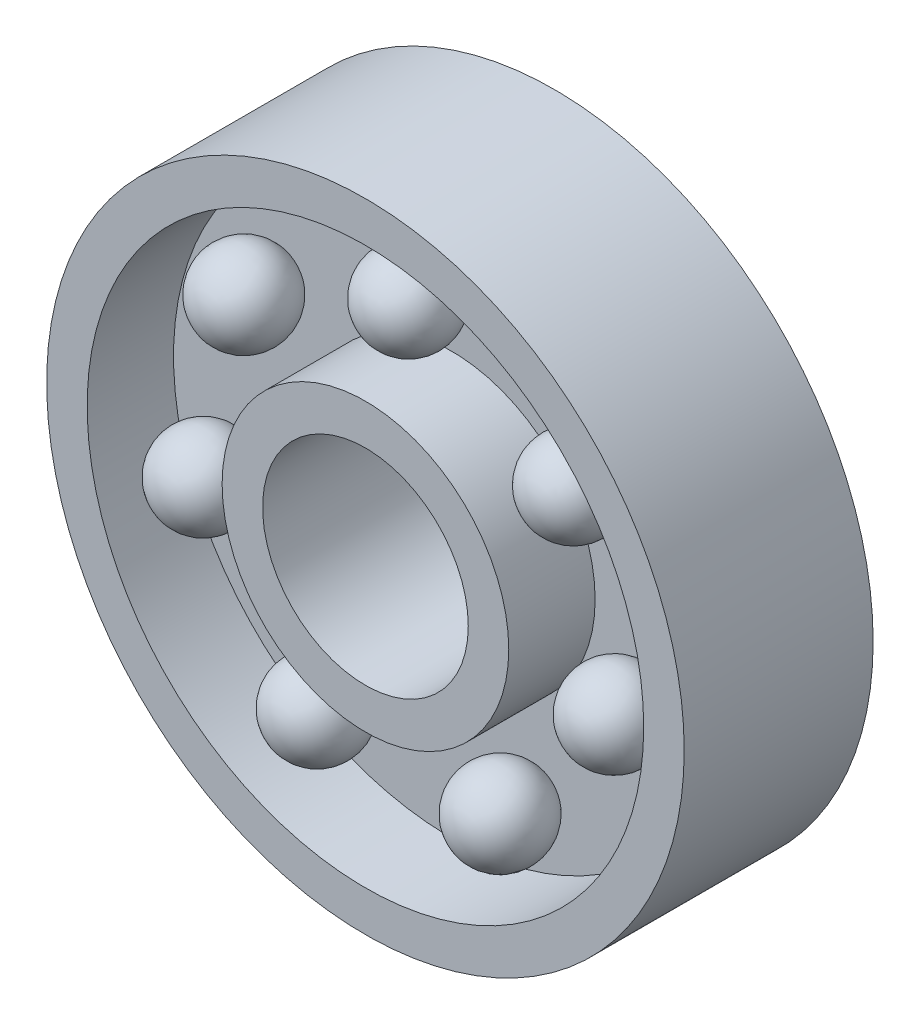
ISO-10303-21;
HEADER;
FILE_DESCRIPTION(('STEP AP214'),'2;1');
FILE_NAME('part.step','',(''),(''),'','','');
FILE_SCHEMA(('AUTOMOTIVE_DESIGN { 1 0 10303 214 1 1 1 1 }'));
ENDSEC;
DATA;
#1=APPLICATION_CONTEXT('core data for automotive mechanical design processes');
#2=APPLICATION_PROTOCOL_DEFINITION('international standard','automotive_design',2000,#1);
#3=PRODUCT_CONTEXT('',#1,'mechanical');
#4=PRODUCT('Part','Part','',(#3));
#5=PRODUCT_RELATED_PRODUCT_CATEGORY('part','',(#4));
#6=PRODUCT_DEFINITION_FORMATION('','',#4);
#7=PRODUCT_DEFINITION_CONTEXT('part definition',#1,'design');
#8=PRODUCT_DEFINITION('design','',#6,#7);
#9=PRODUCT_DEFINITION_SHAPE('','',#8);
#10=(LENGTH_UNIT() NAMED_UNIT(*) SI_UNIT(.MILLI.,.METRE.));
#11=(NAMED_UNIT(*) PLANE_ANGLE_UNIT() SI_UNIT($,.RADIAN.));
#12=(NAMED_UNIT(*) SI_UNIT($,.STERADIAN.) SOLID_ANGLE_UNIT());
#13=UNCERTAINTY_MEASURE_WITH_UNIT(LENGTH_MEASURE(1.E-05),#10,'distance_accuracy_value','');
#14=(GEOMETRIC_REPRESENTATION_CONTEXT(3) GLOBAL_UNCERTAINTY_ASSIGNED_CONTEXT((#13)) GLOBAL_UNIT_ASSIGNED_CONTEXT((#10,
#11,#12)) REPRESENTATION_CONTEXT('',''));
#15=CARTESIAN_POINT('',(0.,0.,0.));
#16=DIRECTION('',(0.,0.,1.));
#17=DIRECTION('',(1.,0.,0.));
#18=AXIS2_PLACEMENT_3D('',#15,#16,#17);
#19=CARTESIAN_POINT('',(0.,-3.81,8.75675918886153));
#20=DIRECTION('',(0.,0.,1.));
#21=DIRECTION('',(1.,0.,0.));
#22=AXIS2_PLACEMENT_3D('',#19,#20,#21);
#23=CYLINDRICAL_SURFACE('',#22,10.31);
#24=CARTESIAN_POINT('',(0.,-3.81,0.300000000000002));
#25=DIRECTION('',(0.,0.,1.));
#26=DIRECTION('',(1.,0.,0.));
#27=AXIS2_PLACEMENT_3D('',#24,#25,#26);
#28=CIRCLE('',#27,10.31);
#29=CARTESIAN_POINT('',(10.31,-3.81,0.300000000000002));
#30=VERTEX_POINT('',#29);
#31=EDGE_CURVE('E13',#30,#30,#28,.T.);
#32=ORIENTED_EDGE('',*,*,#31,.T.);
#33=EDGE_LOOP('',(#32));
#34=FACE_BOUND('',#33,.T.);
#35=CARTESIAN_POINT('',(0.,-3.81,3.2));
#36=DIRECTION('',(0.,0.,1.));
#37=DIRECTION('',(1.,0.,0.));
#38=AXIS2_PLACEMENT_3D('',#35,#36,#37);
#39=CIRCLE('',#38,10.31);
#40=CARTESIAN_POINT('',(10.31,-3.81,3.2));
#41=VERTEX_POINT('',#40);
#42=EDGE_CURVE('E63',#41,#41,#39,.T.);
#43=ORIENTED_EDGE('',*,*,#42,.F.);
#44=EDGE_LOOP('',(#43));
#45=FACE_BOUND('',#44,.T.);
#46=ADVANCED_FACE('F55',(#34,#45),#23,.T.);
#47=CARTESIAN_POINT('',(0.,0.,3.2));
#48=DIRECTION('',(0.,0.,1.));
#49=DIRECTION('',(1.,0.,0.));
#50=AXIS2_PLACEMENT_3D('',#47,#48,#49);
#51=PLANE('',#50);
#52=ORIENTED_EDGE('',*,*,#42,.T.);
#53=EDGE_LOOP('',(#52));
#54=FACE_BOUND('',#53,.T.);
#55=CARTESIAN_POINT('',(0.,-3.81,3.2));
#56=DIRECTION('',(0.,0.,1.));
#57=DIRECTION('',(1.,0.,0.));
#58=AXIS2_PLACEMENT_3D('',#55,#56,#57);
#59=CIRCLE('',#58,5.31);
#60=CARTESIAN_POINT('',(5.31,-3.81,3.2));
#61=VERTEX_POINT('',#60);
#62=EDGE_CURVE('E59',#61,#61,#59,.T.);
#63=ORIENTED_EDGE('',*,*,#62,.F.);
#64=EDGE_LOOP('',(#63));
#65=FACE_BOUND('',#64,.T.);
#66=ADVANCED_FACE('F78',(#54,#65),#51,.T.);
#67=CARTESIAN_POINT('',(0.,0.,0.300000000000001));
#68=DIRECTION('',(0.,0.,-1.));
#69=DIRECTION('',(-1.,0.,0.));
#70=AXIS2_PLACEMENT_3D('',#67,#68,#69);
#71=PLANE('',#70);
#72=ORIENTED_EDGE('',*,*,#31,.F.);
#73=EDGE_LOOP('',(#72));
#74=FACE_BOUND('',#73,.T.);
#75=CARTESIAN_POINT('',(0.,-3.81,0.300000000000002));
#76=DIRECTION('',(0.,0.,1.));
#77=DIRECTION('',(1.,0.,0.));
#78=AXIS2_PLACEMENT_3D('',#75,#76,#77);
#79=CIRCLE('',#78,5.31);
#80=CARTESIAN_POINT('',(5.31,-3.81,0.300000000000002));
#81=VERTEX_POINT('',#80);
#82=EDGE_CURVE('E69',#81,#81,#79,.T.);
#83=ORIENTED_EDGE('',*,*,#82,.T.);
#84=EDGE_LOOP('',(#83));
#85=FACE_BOUND('',#84,.T.);
#86=ADVANCED_FACE('F80',(#74,#85),#71,.T.);
#87=CARTESIAN_POINT('',(0.,-3.81,8.75675918886153));
#88=DIRECTION('',(0.,0.,1.));
#89=DIRECTION('',(1.,0.,0.));
#90=AXIS2_PLACEMENT_3D('',#87,#88,#89);
#91=CYLINDRICAL_SURFACE('',#90,5.31);
#92=ORIENTED_EDGE('',*,*,#62,.T.);
#93=EDGE_LOOP('',(#92));
#94=FACE_BOUND('',#93,.T.);
#95=ORIENTED_EDGE('',*,*,#82,.F.);
#96=EDGE_LOOP('',(#95));
#97=FACE_BOUND('',#96,.T.);
#98=ADVANCED_FACE('F57',(#94,#97),#91,.F.);
#99=CLOSED_SHELL('',(#46,#66,#86,#98));
#100=MANIFOLD_SOLID_BREP('B2',#99);
#101=CARTESIAN_POINT('',(-6.10610387807525,1.05945535251678,5.4));
#102=DIRECTION('',(0.,0.,1.));
#103=DIRECTION('',(-0.781831482468022,0.623489801858743,0.));
#104=AXIS2_PLACEMENT_3D('',#101,#102,#103);
#105=SPHERICAL_SURFACE('',#104,1.6);
#106=CARTESIAN_POINT('',(-6.10610387807525,1.05945535251678,7.));
#107=VERTEX_POINT('',#106);
#108=VERTEX_LOOP('',#107);
#109=FACE_BOUND('',#108,.T.);
#110=ADVANCED_FACE('F137',(#109),#105,.T.);
#111=CLOSED_SHELL('',(#110));
#112=MANIFOLD_SOLID_BREP('B8',#111);
#113=CARTESIAN_POINT('',(-7.61418699414006,-5.54788849419874,5.4));
#114=DIRECTION('',(0.,0.,1.));
#115=DIRECTION('',(-0.974927912181826,-0.222520933956305,0.));
#116=AXIS2_PLACEMENT_3D('',#113,#114,#115);
#117=SPHERICAL_SURFACE('',#116,1.6);
#118=CARTESIAN_POINT('',(-7.61418699414006,-5.54788849419874,7.));
#119=VERTEX_POINT('',#118);
#120=VERTEX_LOOP('',#119);
#121=FACE_BOUND('',#120,.T.);
#122=ADVANCED_FACE('F159',(#121),#117,.T.);
#123=CLOSED_SHELL('',(#122));
#124=MANIFOLD_SOLID_BREP('B51',#123);
#125=CARTESIAN_POINT('',(-3.38863200250818,-10.8465668583179,5.4));
#126=DIRECTION('',(0.,0.,1.));
#127=DIRECTION('',(-0.433883739117565,-0.900968867902416,0.));
#128=AXIS2_PLACEMENT_3D('',#125,#126,#127);
#129=SPHERICAL_SURFACE('',#128,1.6);
#130=CARTESIAN_POINT('',(-3.38863200250818,-10.8465668583179,7.));
#131=VERTEX_POINT('',#130);
#132=VERTEX_LOOP('',#131);
#133=FACE_BOUND('',#132,.T.);
#134=ADVANCED_FACE('F181',(#133),#129,.T.);
#135=CLOSED_SHELL('',(#134));
#136=MANIFOLD_SOLID_BREP('B133',#135);
#137=CARTESIAN_POINT('',(3.38863200250809,-10.8465668583179,5.4));
#138=DIRECTION('',(0.,0.,1.));
#139=DIRECTION('',(0.433883739117553,-0.900968867902422,0.));
#140=AXIS2_PLACEMENT_3D('',#137,#138,#139);
#141=SPHERICAL_SURFACE('',#140,1.6);
#142=CARTESIAN_POINT('',(3.38863200250809,-10.8465668583179,7.));
#143=VERTEX_POINT('',#142);
#144=VERTEX_LOOP('',#143);
#145=FACE_BOUND('',#144,.T.);
#146=ADVANCED_FACE('F203',(#145),#141,.T.);
#147=CLOSED_SHELL('',(#146));
#148=MANIFOLD_SOLID_BREP('B155',#147);
#149=CARTESIAN_POINT('',(7.61418699414003,-5.54788849419885,5.4));
#150=DIRECTION('',(0.,0.,1.));
#151=DIRECTION('',(0.974927912181823,-0.222520933956318,0.));
#152=AXIS2_PLACEMENT_3D('',#149,#150,#151);
#153=SPHERICAL_SURFACE('',#152,1.6);
#154=CARTESIAN_POINT('',(7.61418699414003,-5.54788849419885,7.));
#155=VERTEX_POINT('',#154);
#156=VERTEX_LOOP('',#155);
#157=FACE_BOUND('',#156,.T.);
#158=ADVANCED_FACE('F225',(#157),#153,.T.);
#159=CLOSED_SHELL('',(#158));
#160=MANIFOLD_SOLID_BREP('B177',#159);
#161=CARTESIAN_POINT('',(6.10610387807532,1.0594553525167,5.4));
#162=DIRECTION('',(0.,0.,1.));
#163=DIRECTION('',(0.781831482468031,0.623489801858732,0.));
#164=AXIS2_PLACEMENT_3D('',#161,#162,#163);
#165=SPHERICAL_SURFACE('',#164,1.6);
#166=CARTESIAN_POINT('',(6.10610387807532,1.0594553525167,7.));
#167=VERTEX_POINT('',#166);
#168=VERTEX_LOOP('',#167);
#169=FACE_BOUND('',#168,.T.);
#170=ADVANCED_FACE('F247',(#169),#165,.T.);
#171=CLOSED_SHELL('',(#170));
#172=MANIFOLD_SOLID_BREP('B199',#171);
#173=CARTESIAN_POINT('',(0.,4.,5.4));
#174=DIRECTION('',(0.,0.,1.));
#175=DIRECTION('',(0.,1.,0.));
#176=AXIS2_PLACEMENT_3D('',#173,#174,#175);
#177=SPHERICAL_SURFACE('',#176,1.6);
#178=CARTESIAN_POINT('',(0.,4.,7.));
#179=VERTEX_POINT('',#178);
#180=VERTEX_LOOP('',#179);
#181=FACE_BOUND('',#180,.T.);
#182=ADVANCED_FACE('F271',(#181),#177,.T.);
#183=CLOSED_SHELL('',(#182));
#184=MANIFOLD_SOLID_BREP('B221',#183);
#185=CARTESIAN_POINT('',(0.,1.5,0.));
#186=DIRECTION('',(0.,0.,1.));
#187=DIRECTION('',(1.,0.,0.));
#188=AXIS2_PLACEMENT_3D('',#185,#186,#187);
#189=PLANE('',#188);
#190=CARTESIAN_POINT('',(0.,-3.81,0.));
#191=DIRECTION('',(0.,0.,1.));
#192=DIRECTION('',(1.,0.,0.));
#193=AXIS2_PLACEMENT_3D('',#190,#191,#192);
#194=CIRCLE('',#193,5.31);
#195=CARTESIAN_POINT('',(5.31,-3.81,0.));
#196=VERTEX_POINT('',#195);
#197=EDGE_CURVE('E330',#196,#196,#194,.T.);
#198=ORIENTED_EDGE('',*,*,#197,.F.);
#199=EDGE_LOOP('',(#198));
#200=FACE_BOUND('',#199,.T.);
#201=CARTESIAN_POINT('',(0.,-3.81,0.));
#202=DIRECTION('',(0.,0.,1.));
#203=DIRECTION('',(1.,0.,0.));
#204=AXIS2_PLACEMENT_3D('',#201,#202,#203);
#205=CIRCLE('',#204,3.81);
#206=CARTESIAN_POINT('',(3.81,-3.81,0.));
#207=VERTEX_POINT('',#206);
#208=EDGE_CURVE('E270',#207,#207,#205,.T.);
#209=ORIENTED_EDGE('',*,*,#208,.T.);
#210=EDGE_LOOP('',(#209));
#211=FACE_BOUND('',#210,.T.);
#212=ADVANCED_FACE('F290',(#200,#211),#189,.F.);
#213=CARTESIAN_POINT('',(0.,-3.81,8.75675918886153));
#214=DIRECTION('',(0.,0.,1.));
#215=DIRECTION('',(1.,0.,0.));
#216=AXIS2_PLACEMENT_3D('',#213,#214,#215);
#217=CYLINDRICAL_SURFACE('',#216,3.81);
#218=ORIENTED_EDGE('',*,*,#208,.F.);
#219=EDGE_LOOP('',(#218));
#220=FACE_BOUND('',#219,.T.);
#221=CARTESIAN_POINT('',(0.,-3.81,7.));
#222=DIRECTION('',(0.,0.,1.));
#223=DIRECTION('',(1.,0.,0.));
#224=AXIS2_PLACEMENT_3D('',#221,#222,#223);
#225=CIRCLE('',#224,3.81);
#226=CARTESIAN_POINT('',(3.81,-3.81,7.));
#227=VERTEX_POINT('',#226);
#228=EDGE_CURVE('E296',#227,#227,#225,.T.);
#229=ORIENTED_EDGE('',*,*,#228,.T.);
#230=EDGE_LOOP('',(#229));
#231=FACE_BOUND('',#230,.T.);
#232=ADVANCED_FACE('F337',(#220,#231),#217,.F.);
#233=CARTESIAN_POINT('',(0.,0.,7.));
#234=DIRECTION('',(0.,0.,-1.));
#235=DIRECTION('',(-1.,0.,0.));
#236=AXIS2_PLACEMENT_3D('',#233,#234,#235);
#237=PLANE('',#236);
#238=ORIENTED_EDGE('',*,*,#228,.F.);
#239=EDGE_LOOP('',(#238));
#240=FACE_BOUND('',#239,.T.);
#241=CARTESIAN_POINT('',(0.,-3.81,7.));
#242=DIRECTION('',(0.,0.,1.));
#243=DIRECTION('',(1.,0.,0.));
#244=AXIS2_PLACEMENT_3D('',#241,#242,#243);
#245=CIRCLE('',#244,5.31);
#246=CARTESIAN_POINT('',(5.31,-3.81,7.));
#247=VERTEX_POINT('',#246);
#248=EDGE_CURVE('E300',#247,#247,#245,.T.);
#249=ORIENTED_EDGE('',*,*,#248,.T.);
#250=EDGE_LOOP('',(#249));
#251=FACE_BOUND('',#250,.T.);
#252=ADVANCED_FACE('F341',(#240,#251),#237,.F.);
#253=CARTESIAN_POINT('',(0.,-3.81,8.75675918886153));
#254=DIRECTION('',(0.,0.,1.));
#255=DIRECTION('',(1.,0.,0.));
#256=AXIS2_PLACEMENT_3D('',#253,#254,#255);
#257=CYLINDRICAL_SURFACE('',#256,5.31);
#258=ORIENTED_EDGE('',*,*,#248,.F.);
#259=EDGE_LOOP('',(#258));
#260=FACE_BOUND('',#259,.T.);
#261=CARTESIAN_POINT('',(0.,-3.81,3.8));
#262=DIRECTION('',(0.,0.,1.));
#263=DIRECTION('',(1.,0.,0.));
#264=AXIS2_PLACEMENT_3D('',#261,#262,#263);
#265=CIRCLE('',#264,5.31);
#266=CARTESIAN_POINT('',(5.31,-3.81,3.8));
#267=VERTEX_POINT('',#266);
#268=EDGE_CURVE('E304',#267,#267,#265,.T.);
#269=ORIENTED_EDGE('',*,*,#268,.T.);
#270=EDGE_LOOP('',(#269));
#271=FACE_BOUND('',#270,.T.);
#272=ADVANCED_FACE('F346',(#260,#271),#257,.T.);
#273=CARTESIAN_POINT('',(0.,1.5,3.8));
#274=DIRECTION('',(0.,0.,-1.));
#275=DIRECTION('',(-1.,0.,0.));
#276=AXIS2_PLACEMENT_3D('',#273,#274,#275);
#277=PLANE('',#276);
#278=ORIENTED_EDGE('',*,*,#268,.F.);
#279=EDGE_LOOP('',(#278));
#280=FACE_BOUND('',#279,.T.);
#281=CARTESIAN_POINT('',(0.,-3.81,3.8));
#282=DIRECTION('',(0.,0.,1.));
#283=DIRECTION('',(1.,0.,0.));
#284=AXIS2_PLACEMENT_3D('',#281,#282,#283);
#285=CIRCLE('',#284,10.31);
#286=CARTESIAN_POINT('',(10.31,-3.81,3.8));
#287=VERTEX_POINT('',#286);
#288=EDGE_CURVE('E309',#287,#287,#285,.T.);
#289=ORIENTED_EDGE('',*,*,#288,.T.);
#290=EDGE_LOOP('',(#289));
#291=FACE_BOUND('',#290,.T.);
#292=ADVANCED_FACE('F352',(#280,#291),#277,.F.);
#293=CARTESIAN_POINT('',(0.,-3.81,8.75675918886153));
#294=DIRECTION('',(0.,0.,1.));
#295=DIRECTION('',(1.,0.,0.));
#296=AXIS2_PLACEMENT_3D('',#293,#294,#295);
#297=CYLINDRICAL_SURFACE('',#296,10.31);
#298=ORIENTED_EDGE('',*,*,#288,.F.);
#299=EDGE_LOOP('',(#298));
#300=FACE_BOUND('',#299,.T.);
#301=CARTESIAN_POINT('',(0.,-3.81,7.));
#302=DIRECTION('',(0.,0.,1.));
#303=DIRECTION('',(1.,0.,0.));
#304=AXIS2_PLACEMENT_3D('',#301,#302,#303);
#305=CIRCLE('',#304,10.31);
#306=CARTESIAN_POINT('',(10.31,-3.81,7.));
#307=VERTEX_POINT('',#306);
#308=EDGE_CURVE('E312',#307,#307,#305,.T.);
#309=ORIENTED_EDGE('',*,*,#308,.T.);
#310=EDGE_LOOP('',(#309));
#311=FACE_BOUND('',#310,.T.);
#312=ADVANCED_FACE('F356',(#300,#311),#297,.F.);
#313=CARTESIAN_POINT('',(0.,6.5,7.));
#314=DIRECTION('',(0.,0.,-1.));
#315=DIRECTION('',(-1.,0.,0.));
#316=AXIS2_PLACEMENT_3D('',#313,#314,#315);
#317=PLANE('',#316);
#318=ORIENTED_EDGE('',*,*,#308,.F.);
#319=EDGE_LOOP('',(#318));
#320=FACE_BOUND('',#319,.T.);
#321=CARTESIAN_POINT('',(0.,-3.81,7.));
#322=DIRECTION('',(0.,0.,1.));
#323=DIRECTION('',(1.,0.,0.));
#324=AXIS2_PLACEMENT_3D('',#321,#322,#323);
#325=CIRCLE('',#324,11.81);
#326=CARTESIAN_POINT('',(11.81,-3.81,7.));
#327=VERTEX_POINT('',#326);
#328=EDGE_CURVE('E315',#327,#327,#325,.T.);
#329=ORIENTED_EDGE('',*,*,#328,.T.);
#330=EDGE_LOOP('',(#329));
#331=FACE_BOUND('',#330,.T.);
#332=ADVANCED_FACE('F360',(#320,#331),#317,.F.);
#333=CARTESIAN_POINT('',(0.,-3.81,8.75675918886153));
#334=DIRECTION('',(0.,0.,1.));
#335=DIRECTION('',(1.,0.,0.));
#336=AXIS2_PLACEMENT_3D('',#333,#334,#335);
#337=CYLINDRICAL_SURFACE('',#336,11.81);
#338=ORIENTED_EDGE('',*,*,#328,.F.);
#339=EDGE_LOOP('',(#338));
#340=FACE_BOUND('',#339,.T.);
#341=CARTESIAN_POINT('',(0.,-3.81,0.));
#342=DIRECTION('',(0.,0.,1.));
#343=DIRECTION('',(1.,0.,0.));
#344=AXIS2_PLACEMENT_3D('',#341,#342,#343);
#345=CIRCLE('',#344,11.81);
#346=CARTESIAN_POINT('',(11.81,-3.81,0.));
#347=VERTEX_POINT('',#346);
#348=EDGE_CURVE('E318',#347,#347,#345,.T.);
#349=ORIENTED_EDGE('',*,*,#348,.T.);
#350=EDGE_LOOP('',(#349));
#351=FACE_BOUND('',#350,.T.);
#352=ADVANCED_FACE('F364',(#340,#351),#337,.T.);
#353=CARTESIAN_POINT('',(0.,8.,0.));
#354=DIRECTION('',(0.,0.,1.));
#355=DIRECTION('',(1.,0.,0.));
#356=AXIS2_PLACEMENT_3D('',#353,#354,#355);
#357=PLANE('',#356);
#358=ORIENTED_EDGE('',*,*,#348,.F.);
#359=EDGE_LOOP('',(#358));
#360=FACE_BOUND('',#359,.T.);
#361=CARTESIAN_POINT('',(0.,-3.81,0.));
#362=DIRECTION('',(0.,0.,1.));
#363=DIRECTION('',(1.,0.,0.));
#364=AXIS2_PLACEMENT_3D('',#361,#362,#363);
#365=CIRCLE('',#364,10.31);
#366=CARTESIAN_POINT('',(10.31,-3.81,0.));
#367=VERTEX_POINT('',#366);
#368=EDGE_CURVE('E321',#367,#367,#365,.T.);
#369=ORIENTED_EDGE('',*,*,#368,.T.);
#370=EDGE_LOOP('',(#369));
#371=FACE_BOUND('',#370,.T.);
#372=ADVANCED_FACE('F368',(#360,#371),#357,.F.);
#373=CARTESIAN_POINT('',(0.,-3.81,8.75675918886153));
#374=DIRECTION('',(0.,0.,1.));
#375=DIRECTION('',(1.,0.,0.));
#376=AXIS2_PLACEMENT_3D('',#373,#374,#375);
#377=CYLINDRICAL_SURFACE('',#376,10.31);
#378=ORIENTED_EDGE('',*,*,#368,.F.);
#379=EDGE_LOOP('',(#378));
#380=FACE_BOUND('',#379,.T.);
#381=CARTESIAN_POINT('',(0.,-3.81,3.2));
#382=DIRECTION('',(0.,0.,1.));
#383=DIRECTION('',(1.,0.,0.));
#384=AXIS2_PLACEMENT_3D('',#381,#382,#383);
#385=CIRCLE('',#384,10.31);
#386=CARTESIAN_POINT('',(10.31,-3.81,3.2));
#387=VERTEX_POINT('',#386);
#388=EDGE_CURVE('E324',#387,#387,#385,.T.);
#389=ORIENTED_EDGE('',*,*,#388,.T.);
#390=EDGE_LOOP('',(#389));
#391=FACE_BOUND('',#390,.T.);
#392=ADVANCED_FACE('F372',(#380,#391),#377,.F.);
#393=CARTESIAN_POINT('',(0.,6.5,3.2));
#394=DIRECTION('',(0.,0.,1.));
#395=DIRECTION('',(1.,0.,0.));
#396=AXIS2_PLACEMENT_3D('',#393,#394,#395);
#397=PLANE('',#396);
#398=ORIENTED_EDGE('',*,*,#388,.F.);
#399=EDGE_LOOP('',(#398));
#400=FACE_BOUND('',#399,.T.);
#401=CARTESIAN_POINT('',(0.,-3.81,3.2));
#402=DIRECTION('',(0.,0.,1.));
#403=DIRECTION('',(1.,0.,0.));
#404=AXIS2_PLACEMENT_3D('',#401,#402,#403);
#405=CIRCLE('',#404,5.31);
#406=CARTESIAN_POINT('',(5.31,-3.81,3.2));
#407=VERTEX_POINT('',#406);
#408=EDGE_CURVE('E327',#407,#407,#405,.T.);
#409=ORIENTED_EDGE('',*,*,#408,.T.);
#410=EDGE_LOOP('',(#409));
#411=FACE_BOUND('',#410,.T.);
#412=ADVANCED_FACE('F376',(#400,#411),#397,.F.);
#413=CARTESIAN_POINT('',(0.,-3.81,8.75675918886153));
#414=DIRECTION('',(0.,0.,1.));
#415=DIRECTION('',(1.,0.,0.));
#416=AXIS2_PLACEMENT_3D('',#413,#414,#415);
#417=CYLINDRICAL_SURFACE('',#416,5.31);
#418=ORIENTED_EDGE('',*,*,#408,.F.);
#419=EDGE_LOOP('',(#418));
#420=FACE_BOUND('',#419,.T.);
#421=ORIENTED_EDGE('',*,*,#197,.T.);
#422=EDGE_LOOP('',(#421));
#423=FACE_BOUND('',#422,.T.);
#424=ADVANCED_FACE('F334',(#420,#423),#417,.T.);
#425=CLOSED_SHELL('',(#212,#232,#252,#272,#292,#312,#332,#352,#372,#392,#412,#424));
#426=MANIFOLD_SOLID_BREP('B243',#425);
#427=ADVANCED_BREP_SHAPE_REPRESENTATION('',(#18,#100,#112,#124,#136,#148,#160,#172,#184,#426),#14);
#428=SHAPE_DEFINITION_REPRESENTATION(#9,#427);
ENDSEC;
END-ISO-10303-21;
